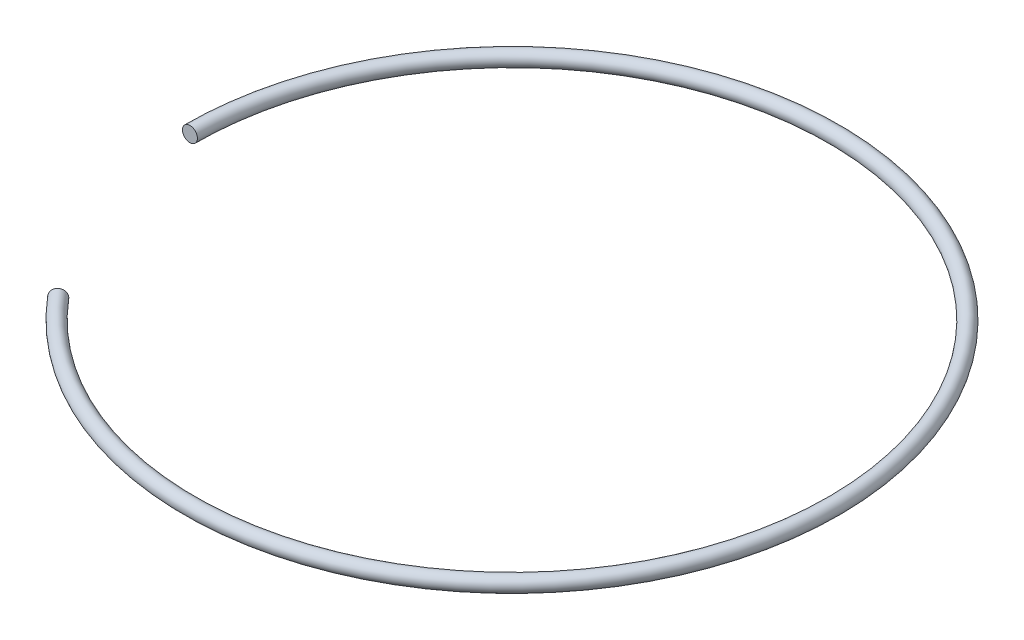
ISO-10303-21;
HEADER;
FILE_DESCRIPTION(('STEP AP214'),'2;1');
FILE_NAME('part.step','',(''),(''),'','','');
FILE_SCHEMA(('AUTOMOTIVE_DESIGN { 1 0 10303 214 1 1 1 1 }'));
ENDSEC;
DATA;
#1=APPLICATION_CONTEXT('core data for automotive mechanical design processes');
#2=APPLICATION_PROTOCOL_DEFINITION('international standard','automotive_design',2000,#1);
#3=PRODUCT_CONTEXT('',#1,'mechanical');
#4=PRODUCT('Part','Part','',(#3));
#5=PRODUCT_RELATED_PRODUCT_CATEGORY('part','',(#4));
#6=PRODUCT_DEFINITION_FORMATION('','',#4);
#7=PRODUCT_DEFINITION_CONTEXT('part definition',#1,'design');
#8=PRODUCT_DEFINITION('design','',#6,#7);
#9=PRODUCT_DEFINITION_SHAPE('','',#8);
#10=(LENGTH_UNIT() NAMED_UNIT(*) SI_UNIT(.MILLI.,.METRE.));
#11=(NAMED_UNIT(*) PLANE_ANGLE_UNIT() SI_UNIT($,.RADIAN.));
#12=(NAMED_UNIT(*) SI_UNIT($,.STERADIAN.) SOLID_ANGLE_UNIT());
#13=UNCERTAINTY_MEASURE_WITH_UNIT(LENGTH_MEASURE(1.E-05),#10,'distance_accuracy_value','');
#14=(GEOMETRIC_REPRESENTATION_CONTEXT(3) GLOBAL_UNCERTAINTY_ASSIGNED_CONTEXT((#13)) GLOBAL_UNIT_ASSIGNED_CONTEXT((#10,
#11,#12)) REPRESENTATION_CONTEXT('',''));
#15=CARTESIAN_POINT('',(0.,0.,0.));
#16=DIRECTION('',(0.,0.,1.));
#17=DIRECTION('',(1.,0.,0.));
#18=AXIS2_PLACEMENT_3D('',#15,#16,#17);
#19=CARTESIAN_POINT('',(0.,0.,0.));
#20=DIRECTION('',(0.64278760968653,0.,0.766044443118986));
#21=DIRECTION('',(0.766044443118986,0.,-0.64278760968653));
#22=AXIS2_PLACEMENT_3D('',#19,#20,#21);
#23=PLANE('',#22);
#24=CARTESIAN_POINT('',(-4.82607999164961,3.56,4.04956194102514));
#25=CARTESIAN_POINT('',(-4.82608813457564,3.57680750835501,4.04956877375136));
#26=CARTESIAN_POINT('',(-4.82828266406093,3.59371844128931,4.05141020263307));
#27=CARTESIAN_POINT('',(-4.83683217422756,3.62558323599696,4.05858409346064));
#28=CARTESIAN_POINT('',(-4.84318715490891,3.64053709777029,4.0639165554065));
#29=CARTESIAN_POINT('',(-4.85933168672002,3.66687074596776,4.07746342609474));
#30=CARTESIAN_POINT('',(-4.86912123784987,3.6782505323918,4.08567783483719));
#31=CARTESIAN_POINT('',(-4.8910337378331,3.6961346650492,4.1040646054913));
#32=CARTESIAN_POINT('',(-4.90315668668648,3.70263901128258,4.11423696740295));
#33=CARTESIAN_POINT('',(-4.92836851686335,3.71004353855515,4.13539220480566));
#34=CARTESIAN_POINT('',(-4.94145739818683,3.71094371959435,4.14637508029671));
#35=CARTESIAN_POINT('',(-4.96712567524787,3.70703844536533,4.16791332211157));
#36=CARTESIAN_POINT('',(-4.97970507098543,3.70223299009711,4.17846868843539));
#37=CARTESIAN_POINT('',(-5.00293582406506,3.68745356130633,4.19796160477649));
#38=CARTESIAN_POINT('',(-5.01358718140714,3.67747958778377,4.20689915479378));
#39=CARTESIAN_POINT('',(-5.03176202938773,3.65350623717002,4.22214966303098));
#40=CARTESIAN_POINT('',(-5.03928552002624,3.63950686007882,4.22846262125091));
#41=CARTESIAN_POINT('',(-5.05035261373162,3.60899118714949,4.23774901549731));
#42=CARTESIAN_POINT('',(-5.05389621679849,3.59247489131134,4.24072245152378));
#43=CARTESIAN_POINT('',(-5.05568371513558,3.57052398291492,4.24222234071915));
#44=CARTESIAN_POINT('',(-5.05589587638294,3.5652670698381,4.24240036514355));
#45=CARTESIAN_POINT('',(-5.05588518165929,3.54319249164499,4.24239139120486));
#46=CARTESIAN_POINT('',(-5.053690652174,3.52628155871068,4.24054996232315));
#47=CARTESIAN_POINT('',(-5.04514114200736,3.49441676400304,4.23337607149559));
#48=CARTESIAN_POINT('',(-5.03878616132601,3.4794629022297,4.22804360954973));
#49=CARTESIAN_POINT('',(-5.0226416295149,3.45312925403224,4.2144967388615));
#50=CARTESIAN_POINT('',(-5.01285207838505,3.4417494676082,4.20628233011905));
#51=CARTESIAN_POINT('',(-4.99093957840181,3.42386533495079,4.18789555946494));
#52=CARTESIAN_POINT('',(-4.97881662954843,3.41736098871742,4.17772319755329));
#53=CARTESIAN_POINT('',(-4.95360479937157,3.40995646144485,4.15656796015058));
#54=CARTESIAN_POINT('',(-4.94051591804809,3.40905628040565,4.14558508465952));
#55=CARTESIAN_POINT('',(-4.91484764098705,3.41296155463467,4.12404684284465));
#56=CARTESIAN_POINT('',(-4.90226824524949,3.41776700990289,4.11349147652083));
#57=CARTESIAN_POINT('',(-4.87903749216985,3.43254643869366,4.09399856017974));
#58=CARTESIAN_POINT('',(-4.86838613482778,3.44252041221623,4.08506101016246));
#59=CARTESIAN_POINT('',(-4.85021128684719,3.46649376282998,4.06981050192525));
#60=CARTESIAN_POINT('',(-4.84268779620869,3.48049313992117,4.06349754370532));
#61=CARTESIAN_POINT('',(-4.8316207025033,3.51100881285051,4.05421114945892));
#62=CARTESIAN_POINT('',(-4.82807709943642,3.52752510868866,4.05123771343246));
#63=CARTESIAN_POINT('',(-4.82628960109933,3.54947601708507,4.04973782423709));
#64=CARTESIAN_POINT('',(-4.82607743985198,3.5547329301619,4.04955979981268));
#65=CARTESIAN_POINT('',(-4.82607999164961,3.56,4.04956194102514));
#66=B_SPLINE_CURVE_WITH_KNOTS('',3,(#24,#25,#26,#27,#28,#29,#30,#31,#32,#33,#34,#35,#36,#37,#38,
#39,#40,#41,#42,#43,#44,#45,#46,#47,#48,#49,#50,#51,#52,#53,#54,#55,#56,#57,#58,#59,#60,#61,#62,
#63,#64,#65),.UNSPECIFIED.,.T.,.F.,(4,2,2,2,2,2,2,2,2,2,2,2,2,2,2,2,2,2,2,2,4),(0.,
0.0503657057955504,0.100731411591102,0.151097117387924,0.201462823184745,0.251828528981567,
0.302194234778387,0.35255994057521,0.402925646372032,0.453291352168854,0.469074755887429,
0.51944046168298,0.56980616747853,0.620171873275353,0.670537579072175,0.720903284868997,
0.771268990665819,0.821634696462638,0.872000402259462,0.922366108056282,0.938149511774858),.UNSPECIFIED.);
#67=CARTESIAN_POINT('',(-4.82607999164961,3.56,4.04956194102514));
#68=VERTEX_POINT('',#67);
#69=EDGE_CURVE('E19',#68,#68,#66,.T.);
#70=ORIENTED_EDGE('',*,*,#69,.F.);
#71=EDGE_LOOP('',(#70));
#72=FACE_BOUND('',#71,.T.);
#73=ADVANCED_FACE('F15',(#72),#23,.F.);
#74=CARTESIAN_POINT('',(0.,0.,0.));
#75=DIRECTION('',(0.,0.,1.));
#76=DIRECTION('',(1.,0.,0.));
#77=AXIS2_PLACEMENT_3D('',#74,#75,#76);
#78=PLANE('',#77);
#79=CARTESIAN_POINT('',(-6.6,3.56,0.));
#80=CARTESIAN_POINT('',(-6.59998937016501,3.57680750835501,0.));
#81=CARTESIAN_POINT('',(-6.59712461537826,3.59371844128931,0.));
#82=CARTESIAN_POINT('',(-6.58596402248651,3.62558323599696,0.));
#83=CARTESIAN_POINT('',(-6.57766818438152,3.64053709777029,0.));
#84=CARTESIAN_POINT('',(-6.55659299487244,3.66687074596776,0.));
#85=CARTESIAN_POINT('',(-6.54381364346823,3.6782505323918,0.));
#86=CARTESIAN_POINT('',(-6.51520890626262,3.6961346650492,0.));
#87=CARTESIAN_POINT('',(-6.49938352046122,3.70263901128258,0.));
#88=CARTESIAN_POINT('',(-6.46647181357094,3.71004353855515,0.));
#89=CARTESIAN_POINT('',(-6.44938549248206,3.71094371959435,0.));
#90=CARTESIAN_POINT('',(-6.41587793650198,3.70703844536533,0.));
#91=CARTESIAN_POINT('',(-6.39945670161078,3.70223299009711,0.));
#92=CARTESIAN_POINT('',(-6.36913110720394,3.68745356130633,0.));
#93=CARTESIAN_POINT('',(-6.35522674768831,3.67747958778377,0.));
#94=CARTESIAN_POINT('',(-6.33150116865195,3.65350623717002,0.));
#95=CARTESIAN_POINT('',(-6.32167994913122,3.63950686007882,0.));
#96=CARTESIAN_POINT('',(-6.30723288433648,3.60899118714949,0.));
#97=CARTESIAN_POINT('',(-6.30260703906248,3.59247489131134,0.));
#98=CARTESIAN_POINT('',(-6.30027362570358,3.57052398291492,0.));
#99=CARTESIAN_POINT('',(-6.29999666886477,3.5652670698381,0.));
#100=CARTESIAN_POINT('',(-6.30001062983499,3.54319249164499,0.));
#101=CARTESIAN_POINT('',(-6.30287538462174,3.52628155871068,0.));
#102=CARTESIAN_POINT('',(-6.31403597751348,3.49441676400304,0.));
#103=CARTESIAN_POINT('',(-6.32233181561848,3.4794629022297,0.));
#104=CARTESIAN_POINT('',(-6.34340700512756,3.45312925403224,0.));
#105=CARTESIAN_POINT('',(-6.35618635653177,3.4417494676082,0.));
#106=CARTESIAN_POINT('',(-6.38479109373738,3.42386533495079,0.));
#107=CARTESIAN_POINT('',(-6.40061647953878,3.41736098871742,0.));
#108=CARTESIAN_POINT('',(-6.43352818642906,3.40995646144485,0.));
#109=CARTESIAN_POINT('',(-6.45061450751794,3.40905628040565,0.));
#110=CARTESIAN_POINT('',(-6.48412206349802,3.41296155463467,0.));
#111=CARTESIAN_POINT('',(-6.50054329838922,3.41776700990289,0.));
#112=CARTESIAN_POINT('',(-6.53086889279606,3.43254643869366,0.));
#113=CARTESIAN_POINT('',(-6.54477325231169,3.44252041221623,0.));
#114=CARTESIAN_POINT('',(-6.56849883134805,3.46649376282998,0.));
#115=CARTESIAN_POINT('',(-6.57832005086878,3.48049313992117,0.));
#116=CARTESIAN_POINT('',(-6.59276711566352,3.51100881285051,0.));
#117=CARTESIAN_POINT('',(-6.59739296093752,3.52752510868866,0.));
#118=CARTESIAN_POINT('',(-6.59972637429642,3.54947601708507,0.));
#119=CARTESIAN_POINT('',(-6.60000333113523,3.5547329301619,0.));
#120=CARTESIAN_POINT('',(-6.6,3.56,0.));
#121=B_SPLINE_CURVE_WITH_KNOTS('',3,(#79,#80,#81,#82,#83,#84,#85,#86,#87,#88,#89,#90,#91,#92,
#93,#94,#95,#96,#97,#98,#99,#100,#101,#102,#103,#104,#105,#106,#107,#108,#109,#110,#111,#112,
#113,#114,#115,#116,#117,#118,#119,#120),.UNSPECIFIED.,.T.,.F.,(4,2,2,2,2,2,2,2,2,2,2,2,2,2,2,2,
2,2,2,2,4),(0.,0.0503657057955509,0.100731411591102,0.151097117387924,0.201462823184746,
0.251828528981568,0.302194234778389,0.352559940575211,0.402925646372033,0.453291352168855,
0.469074755887429,0.51944046168298,0.569806167478531,0.620171873275353,0.670537579072175,
0.720903284868997,0.771268990665818,0.82163469646264,0.872000402259462,0.922366108056284,
0.938149511774859),.UNSPECIFIED.);
#122=CARTESIAN_POINT('',(-6.6,3.56,0.));
#123=VERTEX_POINT('',#122);
#124=EDGE_CURVE('E10',#123,#123,#121,.T.);
#125=ORIENTED_EDGE('',*,*,#124,.F.);
#126=EDGE_LOOP('',(#125));
#127=FACE_BOUND('',#126,.T.);
#128=ADVANCED_FACE('F37',(#127),#78,.T.);
#129=CARTESIAN_POINT('',(0.,3.56,0.));
#130=DIRECTION('',(0.,1.,0.));
#131=DIRECTION('',(0.,0.,1.));
#132=AXIS2_PLACEMENT_3D('',#129,#130,#131);
#133=TOROIDAL_SURFACE('',#132,6.45,0.150000000000001);
#134=ORIENTED_EDGE('',*,*,#124,.T.);
#135=EDGE_LOOP('',(#134));
#136=FACE_BOUND('',#135,.T.);
#137=ORIENTED_EDGE('',*,*,#69,.T.);
#138=EDGE_LOOP('',(#137));
#139=FACE_BOUND('',#138,.T.);
#140=ADVANCED_FACE('F35',(#136,#139),#133,.T.);
#141=CLOSED_SHELL('',(#73,#128,#140));
#142=MANIFOLD_SOLID_BREP('B1',#141);
#143=ADVANCED_BREP_SHAPE_REPRESENTATION('',(#18,#142),#14);
#144=SHAPE_DEFINITION_REPRESENTATION(#9,#143);
ENDSEC;
END-ISO-10303-21;
